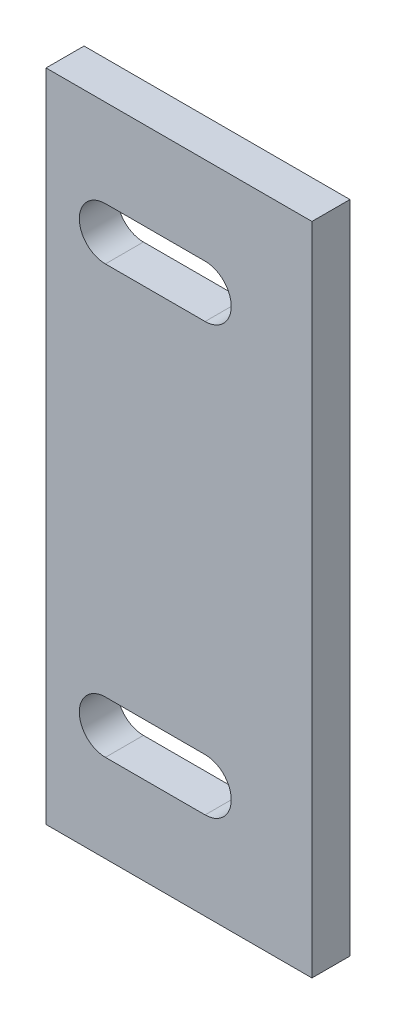
ISO-10303-21;
HEADER;
FILE_DESCRIPTION(('STEP AP214'),'2;1');
FILE_NAME('part.step','',(''),(''),'','','');
FILE_SCHEMA(('AUTOMOTIVE_DESIGN { 1 0 10303 214 1 1 1 1 }'));
ENDSEC;
DATA;
#1=APPLICATION_CONTEXT('core data for automotive mechanical design processes');
#2=APPLICATION_PROTOCOL_DEFINITION('international standard','automotive_design',2000,#1);
#3=PRODUCT_CONTEXT('',#1,'mechanical');
#4=PRODUCT('Part','Part','',(#3));
#5=PRODUCT_RELATED_PRODUCT_CATEGORY('part','',(#4));
#6=PRODUCT_DEFINITION_FORMATION('','',#4);
#7=PRODUCT_DEFINITION_CONTEXT('part definition',#1,'design');
#8=PRODUCT_DEFINITION('design','',#6,#7);
#9=PRODUCT_DEFINITION_SHAPE('','',#8);
#10=(LENGTH_UNIT() NAMED_UNIT(*) SI_UNIT(.MILLI.,.METRE.));
#11=(NAMED_UNIT(*) PLANE_ANGLE_UNIT() SI_UNIT($,.RADIAN.));
#12=(NAMED_UNIT(*) SI_UNIT($,.STERADIAN.) SOLID_ANGLE_UNIT());
#13=UNCERTAINTY_MEASURE_WITH_UNIT(LENGTH_MEASURE(1.E-05),#10,'distance_accuracy_value','');
#14=(GEOMETRIC_REPRESENTATION_CONTEXT(3) GLOBAL_UNCERTAINTY_ASSIGNED_CONTEXT((#13)) GLOBAL_UNIT_ASSIGNED_CONTEXT((#10,
#11,#12)) REPRESENTATION_CONTEXT('',''));
#15=CARTESIAN_POINT('',(0.,0.,0.));
#16=DIRECTION('',(0.,0.,1.));
#17=DIRECTION('',(1.,0.,0.));
#18=AXIS2_PLACEMENT_3D('',#15,#16,#17);
#19=CARTESIAN_POINT('',(-28.,34.5,0.));
#20=DIRECTION('',(-1.,0.,0.));
#21=DIRECTION('',(0.,-1.,0.));
#22=AXIS2_PLACEMENT_3D('',#19,#20,#21);
#23=PLANE('',#22);
#24=DIRECTION('',(0.,-1.,0.));
#25=VECTOR('',#24,1.);
#26=CARTESIAN_POINT('',(-28.,34.5,4.));
#27=LINE('',#26,#25);
#28=CARTESIAN_POINT('',(-28.,34.5,4.));
#29=VERTEX_POINT('',#28);
#30=CARTESIAN_POINT('',(-28.,-34.5,4.));
#31=VERTEX_POINT('',#30);
#32=EDGE_CURVE('E195',#29,#31,#27,.T.);
#33=ORIENTED_EDGE('',*,*,#32,.F.);
#34=DIRECTION('',(0.,0.,1.));
#35=VECTOR('',#34,1.);
#36=CARTESIAN_POINT('',(-28.,34.5,0.));
#37=LINE('',#36,#35);
#38=CARTESIAN_POINT('',(-28.,34.5,0.));
#39=VERTEX_POINT('',#38);
#40=EDGE_CURVE('E11',#39,#29,#37,.T.);
#41=ORIENTED_EDGE('',*,*,#40,.F.);
#42=DIRECTION('',(0.,-1.,0.));
#43=VECTOR('',#42,1.);
#44=CARTESIAN_POINT('',(-28.,34.5,0.));
#45=LINE('',#44,#43);
#46=CARTESIAN_POINT('',(-28.,-34.5,0.));
#47=VERTEX_POINT('',#46);
#48=EDGE_CURVE('E200',#39,#47,#45,.T.);
#49=ORIENTED_EDGE('',*,*,#48,.T.);
#50=DIRECTION('',(0.,0.,1.));
#51=VECTOR('',#50,1.);
#52=CARTESIAN_POINT('',(-28.,-34.5,0.));
#53=LINE('',#52,#51);
#54=EDGE_CURVE('E42',#47,#31,#53,.T.);
#55=ORIENTED_EDGE('',*,*,#54,.T.);
#56=EDGE_LOOP('',(#33,#41,#49,#55));
#57=FACE_BOUND('',#56,.T.);
#58=ADVANCED_FACE('F41',(#57),#23,.T.);
#59=CARTESIAN_POINT('',(0.,34.5,0.));
#60=DIRECTION('',(0.,1.,0.));
#61=DIRECTION('',(0.,0.,1.));
#62=AXIS2_PLACEMENT_3D('',#59,#60,#61);
#63=PLANE('',#62);
#64=DIRECTION('',(-1.,0.,0.));
#65=VECTOR('',#64,1.);
#66=CARTESIAN_POINT('',(0.,34.5,4.));
#67=LINE('',#66,#65);
#68=CARTESIAN_POINT('',(0.,34.5,4.));
#69=VERTEX_POINT('',#68);
#70=EDGE_CURVE('E201',#69,#29,#67,.T.);
#71=ORIENTED_EDGE('',*,*,#70,.F.);
#72=DIRECTION('',(0.,0.,1.));
#73=VECTOR('',#72,1.);
#74=CARTESIAN_POINT('',(0.,34.5,0.));
#75=LINE('',#74,#73);
#76=CARTESIAN_POINT('',(0.,34.5,0.));
#77=VERTEX_POINT('',#76);
#78=EDGE_CURVE('E47',#77,#69,#75,.T.);
#79=ORIENTED_EDGE('',*,*,#78,.F.);
#80=DIRECTION('',(-1.,0.,0.));
#81=VECTOR('',#80,1.);
#82=CARTESIAN_POINT('',(0.,34.5,0.));
#83=LINE('',#82,#81);
#84=EDGE_CURVE('E209',#77,#39,#83,.T.);
#85=ORIENTED_EDGE('',*,*,#84,.T.);
#86=ORIENTED_EDGE('',*,*,#40,.T.);
#87=EDGE_LOOP('',(#71,#79,#85,#86));
#88=FACE_BOUND('',#87,.T.);
#89=ADVANCED_FACE('F232',(#88),#63,.T.);
#90=CARTESIAN_POINT('',(0.,-34.5,0.));
#91=DIRECTION('',(1.,0.,0.));
#92=DIRECTION('',(0.,0.,-1.));
#93=AXIS2_PLACEMENT_3D('',#90,#91,#92);
#94=PLANE('',#93);
#95=DIRECTION('',(0.,1.,0.));
#96=VECTOR('',#95,1.);
#97=CARTESIAN_POINT('',(0.,-34.5,4.));
#98=LINE('',#97,#96);
#99=CARTESIAN_POINT('',(0.,-34.5,4.));
#100=VERTEX_POINT('',#99);
#101=EDGE_CURVE('E219',#100,#69,#98,.T.);
#102=ORIENTED_EDGE('',*,*,#101,.F.);
#103=DIRECTION('',(0.,0.,1.));
#104=VECTOR('',#103,1.);
#105=CARTESIAN_POINT('',(0.,-34.5,0.));
#106=LINE('',#105,#104);
#107=CARTESIAN_POINT('',(0.,-34.5,0.));
#108=VERTEX_POINT('',#107);
#109=EDGE_CURVE('E225',#108,#100,#106,.T.);
#110=ORIENTED_EDGE('',*,*,#109,.F.);
#111=DIRECTION('',(0.,1.,0.));
#112=VECTOR('',#111,1.);
#113=CARTESIAN_POINT('',(0.,-34.5,0.));
#114=LINE('',#113,#112);
#115=EDGE_CURVE('E207',#108,#77,#114,.T.);
#116=ORIENTED_EDGE('',*,*,#115,.T.);
#117=ORIENTED_EDGE('',*,*,#78,.T.);
#118=EDGE_LOOP('',(#102,#110,#116,#117));
#119=FACE_BOUND('',#118,.T.);
#120=ADVANCED_FACE('F239',(#119),#94,.T.);
#121=CARTESIAN_POINT('',(-28.,-34.5,0.));
#122=DIRECTION('',(0.,-1.,0.));
#123=DIRECTION('',(0.,0.,-1.));
#124=AXIS2_PLACEMENT_3D('',#121,#122,#123);
#125=PLANE('',#124);
#126=DIRECTION('',(1.,0.,0.));
#127=VECTOR('',#126,1.);
#128=CARTESIAN_POINT('',(-28.,-34.5,4.));
#129=LINE('',#128,#127);
#130=EDGE_CURVE('E211',#31,#100,#129,.T.);
#131=ORIENTED_EDGE('',*,*,#130,.F.);
#132=ORIENTED_EDGE('',*,*,#54,.F.);
#133=DIRECTION('',(1.,0.,0.));
#134=VECTOR('',#133,1.);
#135=CARTESIAN_POINT('',(-28.,-34.5,0.));
#136=LINE('',#135,#134);
#137=EDGE_CURVE('E205',#47,#108,#136,.T.);
#138=ORIENTED_EDGE('',*,*,#137,.T.);
#139=ORIENTED_EDGE('',*,*,#109,.T.);
#140=EDGE_LOOP('',(#131,#132,#138,#139));
#141=FACE_BOUND('',#140,.T.);
#142=ADVANCED_FACE('F229',(#141),#125,.T.);
#143=CARTESIAN_POINT('',(0.,0.,0.));
#144=DIRECTION('',(0.,0.,1.));
#145=DIRECTION('',(1.,0.,0.));
#146=AXIS2_PLACEMENT_3D('',#143,#144,#145);
#147=PLANE('',#146);
#148=DIRECTION('',(-1.,0.,0.));
#149=VECTOR('',#148,1.);
#150=CARTESIAN_POINT('',(-21.75,-19.75,0.));
#151=LINE('',#150,#149);
#152=CARTESIAN_POINT('',(-11.25,-19.75,0.));
#153=VERTEX_POINT('',#152);
#154=CARTESIAN_POINT('',(-21.75,-19.75,0.));
#155=VERTEX_POINT('',#154);
#156=EDGE_CURVE('E136',#153,#155,#151,.T.);
#157=ORIENTED_EDGE('',*,*,#156,.T.);
#158=CARTESIAN_POINT('',(-21.75,-22.5,0.));
#159=DIRECTION('',(0.,0.,1.));
#160=DIRECTION('',(-1.,0.,0.));
#161=AXIS2_PLACEMENT_3D('',#158,#159,#160);
#162=CIRCLE('',#161,2.75);
#163=CARTESIAN_POINT('',(-21.75,-25.25,0.));
#164=VERTEX_POINT('',#163);
#165=EDGE_CURVE('E134',#155,#164,#162,.T.);
#166=ORIENTED_EDGE('',*,*,#165,.T.);
#167=DIRECTION('',(1.,0.,0.));
#168=VECTOR('',#167,1.);
#169=CARTESIAN_POINT('',(-11.25,-25.25,0.));
#170=LINE('',#169,#168);
#171=CARTESIAN_POINT('',(-11.25,-25.25,0.));
#172=VERTEX_POINT('',#171);
#173=EDGE_CURVE('E142',#164,#172,#170,.T.);
#174=ORIENTED_EDGE('',*,*,#173,.T.);
#175=CARTESIAN_POINT('',(-11.25,-22.5,0.));
#176=DIRECTION('',(0.,0.,1.));
#177=DIRECTION('',(-1.,0.,0.));
#178=AXIS2_PLACEMENT_3D('',#175,#176,#177);
#179=CIRCLE('',#178,2.75);
#180=EDGE_CURVE('E60',#172,#153,#179,.T.);
#181=ORIENTED_EDGE('',*,*,#180,.T.);
#182=EDGE_LOOP('',(#157,#166,#174,#181));
#183=FACE_BOUND('',#182,.T.);
#184=DIRECTION('',(-1.,0.,0.));
#185=VECTOR('',#184,1.);
#186=CARTESIAN_POINT('',(-21.75,25.25,0.));
#187=LINE('',#186,#185);
#188=CARTESIAN_POINT('',(-11.25,25.25,0.));
#189=VERTEX_POINT('',#188);
#190=CARTESIAN_POINT('',(-21.75,25.25,0.));
#191=VERTEX_POINT('',#190);
#192=EDGE_CURVE('E180',#189,#191,#187,.T.);
#193=ORIENTED_EDGE('',*,*,#192,.T.);
#194=CARTESIAN_POINT('',(-21.75,22.5,0.));
#195=DIRECTION('',(0.,0.,1.));
#196=DIRECTION('',(-1.,0.,0.));
#197=AXIS2_PLACEMENT_3D('',#194,#195,#196);
#198=CIRCLE('',#197,2.75);
#199=CARTESIAN_POINT('',(-21.75,19.75,0.));
#200=VERTEX_POINT('',#199);
#201=EDGE_CURVE('E170',#191,#200,#198,.T.);
#202=ORIENTED_EDGE('',*,*,#201,.T.);
#203=DIRECTION('',(1.,0.,0.));
#204=VECTOR('',#203,1.);
#205=CARTESIAN_POINT('',(-11.25,19.75,0.));
#206=LINE('',#205,#204);
#207=CARTESIAN_POINT('',(-11.25,19.75,0.));
#208=VERTEX_POINT('',#207);
#209=EDGE_CURVE('E167',#200,#208,#206,.T.);
#210=ORIENTED_EDGE('',*,*,#209,.T.);
#211=CARTESIAN_POINT('',(-11.25,22.5,0.));
#212=DIRECTION('',(0.,0.,1.));
#213=DIRECTION('',(-1.,0.,0.));
#214=AXIS2_PLACEMENT_3D('',#211,#212,#213);
#215=CIRCLE('',#214,2.75);
#216=EDGE_CURVE('E172',#208,#189,#215,.T.);
#217=ORIENTED_EDGE('',*,*,#216,.T.);
#218=EDGE_LOOP('',(#193,#202,#210,#217));
#219=FACE_BOUND('',#218,.T.);
#220=ORIENTED_EDGE('',*,*,#48,.F.);
#221=ORIENTED_EDGE('',*,*,#84,.F.);
#222=ORIENTED_EDGE('',*,*,#115,.F.);
#223=ORIENTED_EDGE('',*,*,#137,.F.);
#224=EDGE_LOOP('',(#220,#221,#222,#223));
#225=FACE_BOUND('',#224,.T.);
#226=ADVANCED_FACE('F143',(#183,#219,#225),#147,.F.);
#227=CARTESIAN_POINT('',(0.,0.,4.));
#228=DIRECTION('',(0.,0.,1.));
#229=DIRECTION('',(1.,0.,0.));
#230=AXIS2_PLACEMENT_3D('',#227,#228,#229);
#231=PLANE('',#230);
#232=CARTESIAN_POINT('',(-21.75,-22.5,4.));
#233=DIRECTION('',(0.,0.,1.));
#234=DIRECTION('',(-1.,0.,0.));
#235=AXIS2_PLACEMENT_3D('',#232,#233,#234);
#236=CIRCLE('',#235,2.75);
#237=CARTESIAN_POINT('',(-21.75,-19.75,4.));
#238=VERTEX_POINT('',#237);
#239=CARTESIAN_POINT('',(-21.75,-25.25,4.));
#240=VERTEX_POINT('',#239);
#241=EDGE_CURVE('E63',#238,#240,#236,.T.);
#242=ORIENTED_EDGE('',*,*,#241,.F.);
#243=DIRECTION('',(-1.,0.,0.));
#244=VECTOR('',#243,1.);
#245=CARTESIAN_POINT('',(-21.75,-19.75,4.));
#246=LINE('',#245,#244);
#247=CARTESIAN_POINT('',(-11.25,-19.75,4.));
#248=VERTEX_POINT('',#247);
#249=EDGE_CURVE('E149',#248,#238,#246,.T.);
#250=ORIENTED_EDGE('',*,*,#249,.F.);
#251=CARTESIAN_POINT('',(-11.25,-22.5,4.));
#252=DIRECTION('',(0.,0.,1.));
#253=DIRECTION('',(-1.,0.,0.));
#254=AXIS2_PLACEMENT_3D('',#251,#252,#253);
#255=CIRCLE('',#254,2.75);
#256=CARTESIAN_POINT('',(-11.25,-25.25,4.));
#257=VERTEX_POINT('',#256);
#258=EDGE_CURVE('E153',#257,#248,#255,.T.);
#259=ORIENTED_EDGE('',*,*,#258,.F.);
#260=DIRECTION('',(1.,0.,0.));
#261=VECTOR('',#260,1.);
#262=CARTESIAN_POINT('',(-11.25,-25.25,4.));
#263=LINE('',#262,#261);
#264=EDGE_CURVE('E160',#240,#257,#263,.T.);
#265=ORIENTED_EDGE('',*,*,#264,.F.);
#266=EDGE_LOOP('',(#242,#250,#259,#265));
#267=FACE_BOUND('',#266,.T.);
#268=CARTESIAN_POINT('',(-21.75,22.5,4.));
#269=DIRECTION('',(0.,0.,1.));
#270=DIRECTION('',(-1.,0.,0.));
#271=AXIS2_PLACEMENT_3D('',#268,#269,#270);
#272=CIRCLE('',#271,2.75);
#273=CARTESIAN_POINT('',(-21.75,25.25,4.));
#274=VERTEX_POINT('',#273);
#275=CARTESIAN_POINT('',(-21.75,19.75,4.));
#276=VERTEX_POINT('',#275);
#277=EDGE_CURVE('E161',#274,#276,#272,.T.);
#278=ORIENTED_EDGE('',*,*,#277,.F.);
#279=DIRECTION('',(-1.,0.,0.));
#280=VECTOR('',#279,1.);
#281=CARTESIAN_POINT('',(-21.75,25.25,4.));
#282=LINE('',#281,#280);
#283=CARTESIAN_POINT('',(-11.25,25.25,4.));
#284=VERTEX_POINT('',#283);
#285=EDGE_CURVE('E171',#284,#274,#282,.T.);
#286=ORIENTED_EDGE('',*,*,#285,.F.);
#287=CARTESIAN_POINT('',(-11.25,22.5,4.));
#288=DIRECTION('',(0.,0.,1.));
#289=DIRECTION('',(-1.,0.,0.));
#290=AXIS2_PLACEMENT_3D('',#287,#288,#289);
#291=CIRCLE('',#290,2.75);
#292=CARTESIAN_POINT('',(-11.25,19.75,4.));
#293=VERTEX_POINT('',#292);
#294=EDGE_CURVE('E184',#293,#284,#291,.T.);
#295=ORIENTED_EDGE('',*,*,#294,.F.);
#296=DIRECTION('',(1.,0.,0.));
#297=VECTOR('',#296,1.);
#298=CARTESIAN_POINT('',(-11.25,19.75,4.));
#299=LINE('',#298,#297);
#300=EDGE_CURVE('E185',#276,#293,#299,.T.);
#301=ORIENTED_EDGE('',*,*,#300,.F.);
#302=EDGE_LOOP('',(#278,#286,#295,#301));
#303=FACE_BOUND('',#302,.T.);
#304=ORIENTED_EDGE('',*,*,#32,.T.);
#305=ORIENTED_EDGE('',*,*,#130,.T.);
#306=ORIENTED_EDGE('',*,*,#101,.T.);
#307=ORIENTED_EDGE('',*,*,#70,.T.);
#308=EDGE_LOOP('',(#304,#305,#306,#307));
#309=FACE_BOUND('',#308,.T.);
#310=ADVANCED_FACE('F235',(#267,#303,#309),#231,.T.);
#311=CARTESIAN_POINT('',(-21.75,22.5,0.));
#312=DIRECTION('',(0.,0.,1.));
#313=DIRECTION('',(1.,0.,0.));
#314=AXIS2_PLACEMENT_3D('',#311,#312,#313);
#315=CYLINDRICAL_SURFACE('',#314,2.75);
#316=ORIENTED_EDGE('',*,*,#277,.T.);
#317=DIRECTION('',(0.,0.,1.));
#318=VECTOR('',#317,1.);
#319=CARTESIAN_POINT('',(-21.75,19.75,0.));
#320=LINE('',#319,#318);
#321=EDGE_CURVE('E179',#200,#276,#320,.T.);
#322=ORIENTED_EDGE('',*,*,#321,.F.);
#323=ORIENTED_EDGE('',*,*,#201,.F.);
#324=DIRECTION('',(0.,0.,1.));
#325=VECTOR('',#324,1.);
#326=CARTESIAN_POINT('',(-21.75,25.25,0.));
#327=LINE('',#326,#325);
#328=EDGE_CURVE('E188',#191,#274,#327,.T.);
#329=ORIENTED_EDGE('',*,*,#328,.T.);
#330=EDGE_LOOP('',(#316,#322,#323,#329));
#331=FACE_BOUND('',#330,.T.);
#332=ADVANCED_FACE('F285',(#331),#315,.F.);
#333=CARTESIAN_POINT('',(-21.75,25.25,0.));
#334=DIRECTION('',(0.,1.,0.));
#335=DIRECTION('',(0.,0.,1.));
#336=AXIS2_PLACEMENT_3D('',#333,#334,#335);
#337=PLANE('',#336);
#338=ORIENTED_EDGE('',*,*,#285,.T.);
#339=ORIENTED_EDGE('',*,*,#328,.F.);
#340=ORIENTED_EDGE('',*,*,#192,.F.);
#341=DIRECTION('',(0.,0.,1.));
#342=VECTOR('',#341,1.);
#343=CARTESIAN_POINT('',(-11.25,25.25,0.));
#344=LINE('',#343,#342);
#345=EDGE_CURVE('E194',#189,#284,#344,.T.);
#346=ORIENTED_EDGE('',*,*,#345,.T.);
#347=EDGE_LOOP('',(#338,#339,#340,#346));
#348=FACE_BOUND('',#347,.T.);
#349=ADVANCED_FACE('F295',(#348),#337,.F.);
#350=CARTESIAN_POINT('',(-11.25,22.5,0.));
#351=DIRECTION('',(0.,0.,1.));
#352=DIRECTION('',(1.,0.,0.));
#353=AXIS2_PLACEMENT_3D('',#350,#351,#352);
#354=CYLINDRICAL_SURFACE('',#353,2.75);
#355=ORIENTED_EDGE('',*,*,#294,.T.);
#356=ORIENTED_EDGE('',*,*,#345,.F.);
#357=ORIENTED_EDGE('',*,*,#216,.F.);
#358=DIRECTION('',(0.,0.,1.));
#359=VECTOR('',#358,1.);
#360=CARTESIAN_POINT('',(-11.25,19.75,0.));
#361=LINE('',#360,#359);
#362=EDGE_CURVE('E193',#208,#293,#361,.T.);
#363=ORIENTED_EDGE('',*,*,#362,.T.);
#364=EDGE_LOOP('',(#355,#356,#357,#363));
#365=FACE_BOUND('',#364,.T.);
#366=ADVANCED_FACE('F302',(#365),#354,.F.);
#367=CARTESIAN_POINT('',(-11.25,19.75,0.));
#368=DIRECTION('',(0.,-1.,0.));
#369=DIRECTION('',(0.,0.,-1.));
#370=AXIS2_PLACEMENT_3D('',#367,#368,#369);
#371=PLANE('',#370);
#372=ORIENTED_EDGE('',*,*,#300,.T.);
#373=ORIENTED_EDGE('',*,*,#362,.F.);
#374=ORIENTED_EDGE('',*,*,#209,.F.);
#375=ORIENTED_EDGE('',*,*,#321,.T.);
#376=EDGE_LOOP('',(#372,#373,#374,#375));
#377=FACE_BOUND('',#376,.T.);
#378=ADVANCED_FACE('F313',(#377),#371,.F.);
#379=CARTESIAN_POINT('',(-21.75,-22.5,0.));
#380=DIRECTION('',(0.,0.,1.));
#381=DIRECTION('',(1.,0.,0.));
#382=AXIS2_PLACEMENT_3D('',#379,#380,#381);
#383=CYLINDRICAL_SURFACE('',#382,2.75);
#384=ORIENTED_EDGE('',*,*,#241,.T.);
#385=DIRECTION('',(0.,0.,1.));
#386=VECTOR('',#385,1.);
#387=CARTESIAN_POINT('',(-21.75,-25.25,0.));
#388=LINE('',#387,#386);
#389=EDGE_CURVE('E129',#164,#240,#388,.T.);
#390=ORIENTED_EDGE('',*,*,#389,.F.);
#391=ORIENTED_EDGE('',*,*,#165,.F.);
#392=DIRECTION('',(0.,0.,1.));
#393=VECTOR('',#392,1.);
#394=CARTESIAN_POINT('',(-21.75,-19.75,0.));
#395=LINE('',#394,#393);
#396=EDGE_CURVE('E163',#155,#238,#395,.T.);
#397=ORIENTED_EDGE('',*,*,#396,.T.);
#398=EDGE_LOOP('',(#384,#390,#391,#397));
#399=FACE_BOUND('',#398,.T.);
#400=ADVANCED_FACE('F128',(#399),#383,.F.);
#401=CARTESIAN_POINT('',(-21.75,-19.75,0.));
#402=DIRECTION('',(0.,1.,0.));
#403=DIRECTION('',(0.,0.,1.));
#404=AXIS2_PLACEMENT_3D('',#401,#402,#403);
#405=PLANE('',#404);
#406=ORIENTED_EDGE('',*,*,#249,.T.);
#407=ORIENTED_EDGE('',*,*,#396,.F.);
#408=ORIENTED_EDGE('',*,*,#156,.F.);
#409=DIRECTION('',(0.,0.,1.));
#410=VECTOR('',#409,1.);
#411=CARTESIAN_POINT('',(-11.25,-19.75,0.));
#412=LINE('',#411,#410);
#413=EDGE_CURVE('E165',#153,#248,#412,.T.);
#414=ORIENTED_EDGE('',*,*,#413,.T.);
#415=EDGE_LOOP('',(#406,#407,#408,#414));
#416=FACE_BOUND('',#415,.T.);
#417=ADVANCED_FACE('F331',(#416),#405,.F.);
#418=CARTESIAN_POINT('',(-11.25,-22.5,0.));
#419=DIRECTION('',(0.,0.,1.));
#420=DIRECTION('',(1.,0.,0.));
#421=AXIS2_PLACEMENT_3D('',#418,#419,#420);
#422=CYLINDRICAL_SURFACE('',#421,2.75);
#423=ORIENTED_EDGE('',*,*,#258,.T.);
#424=ORIENTED_EDGE('',*,*,#413,.F.);
#425=ORIENTED_EDGE('',*,*,#180,.F.);
#426=DIRECTION('',(0.,0.,1.));
#427=VECTOR('',#426,1.);
#428=CARTESIAN_POINT('',(-11.25,-25.25,0.));
#429=LINE('',#428,#427);
#430=EDGE_CURVE('E140',#172,#257,#429,.T.);
#431=ORIENTED_EDGE('',*,*,#430,.T.);
#432=EDGE_LOOP('',(#423,#424,#425,#431));
#433=FACE_BOUND('',#432,.T.);
#434=ADVANCED_FACE('F345',(#433),#422,.F.);
#435=CARTESIAN_POINT('',(-11.25,-25.25,0.));
#436=DIRECTION('',(0.,-1.,0.));
#437=DIRECTION('',(0.,0.,-1.));
#438=AXIS2_PLACEMENT_3D('',#435,#436,#437);
#439=PLANE('',#438);
#440=ORIENTED_EDGE('',*,*,#264,.T.);
#441=ORIENTED_EDGE('',*,*,#430,.F.);
#442=ORIENTED_EDGE('',*,*,#173,.F.);
#443=ORIENTED_EDGE('',*,*,#389,.T.);
#444=EDGE_LOOP('',(#440,#441,#442,#443));
#445=FACE_BOUND('',#444,.T.);
#446=ADVANCED_FACE('F145',(#445),#439,.F.);
#447=CLOSED_SHELL('',(#58,#89,#120,#142,#226,#310,#332,#349,#366,#378,#400,#417,#434,#446));
#448=MANIFOLD_SOLID_BREP('B2',#447);
#449=ADVANCED_BREP_SHAPE_REPRESENTATION('',(#18,#448),#14);
#450=SHAPE_DEFINITION_REPRESENTATION(#9,#449);
ENDSEC;
END-ISO-10303-21;
